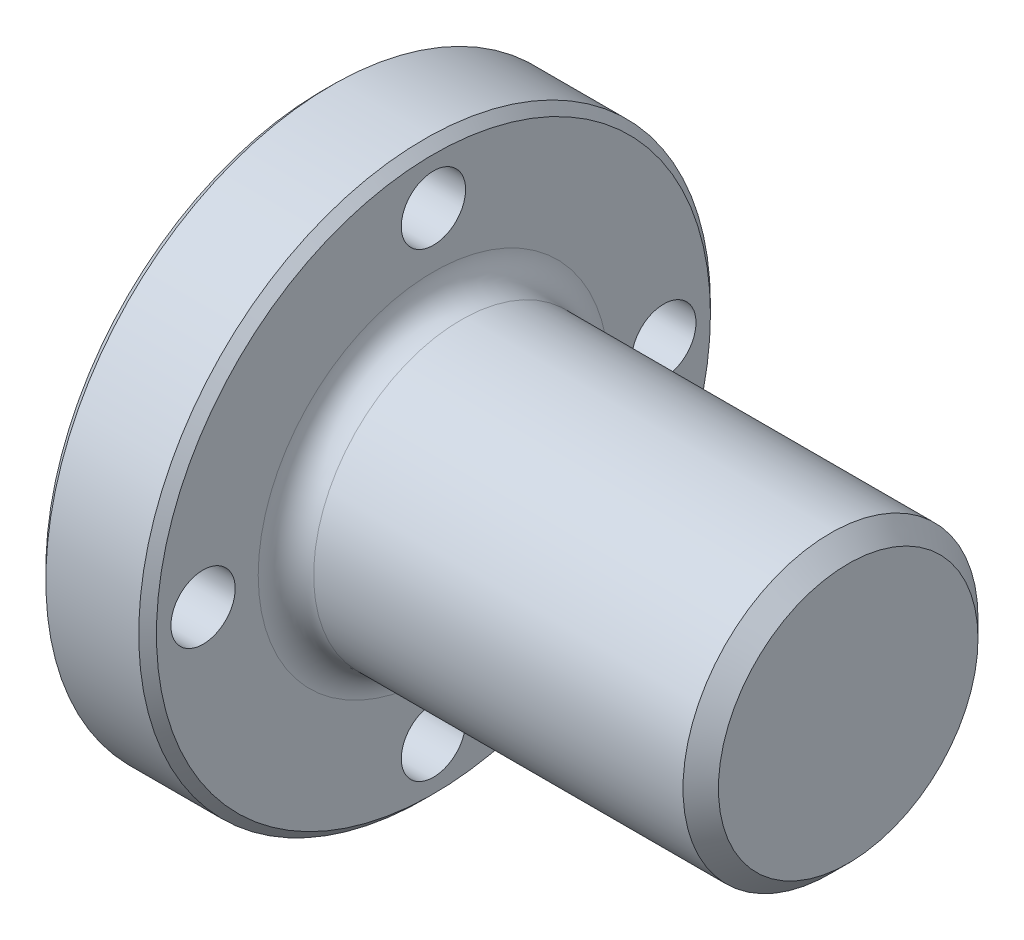
ISO-10303-21;
HEADER;
FILE_DESCRIPTION(('STEP AP214'),'2;1');
FILE_NAME('part.step','',(''),(''),'','','');
FILE_SCHEMA(('AUTOMOTIVE_DESIGN { 1 0 10303 214 1 1 1 1 }'));
ENDSEC;
DATA;
#1=APPLICATION_CONTEXT('core data for automotive mechanical design processes');
#2=APPLICATION_PROTOCOL_DEFINITION('international standard','automotive_design',2000,#1);
#3=PRODUCT_CONTEXT('',#1,'mechanical');
#4=PRODUCT('Part','Part','',(#3));
#5=PRODUCT_RELATED_PRODUCT_CATEGORY('part','',(#4));
#6=PRODUCT_DEFINITION_FORMATION('','',#4);
#7=PRODUCT_DEFINITION_CONTEXT('part definition',#1,'design');
#8=PRODUCT_DEFINITION('design','',#6,#7);
#9=PRODUCT_DEFINITION_SHAPE('','',#8);
#10=(LENGTH_UNIT() NAMED_UNIT(*) SI_UNIT(.MILLI.,.METRE.));
#11=(NAMED_UNIT(*) PLANE_ANGLE_UNIT() SI_UNIT($,.RADIAN.));
#12=(NAMED_UNIT(*) SI_UNIT($,.STERADIAN.) SOLID_ANGLE_UNIT());
#13=UNCERTAINTY_MEASURE_WITH_UNIT(LENGTH_MEASURE(1.E-05),#10,'distance_accuracy_value','');
#14=(GEOMETRIC_REPRESENTATION_CONTEXT(3) GLOBAL_UNCERTAINTY_ASSIGNED_CONTEXT((#13)) GLOBAL_UNIT_ASSIGNED_CONTEXT((#10,
#11,#12)) REPRESENTATION_CONTEXT('',''));
#15=CARTESIAN_POINT('',(0.,0.,0.));
#16=DIRECTION('',(0.,0.,1.));
#17=DIRECTION('',(1.,0.,0.));
#18=AXIS2_PLACEMENT_3D('',#15,#16,#17);
#19=CARTESIAN_POINT('',(9.525,0.,0.));
#20=DIRECTION('',(-1.,0.,0.));
#21=DIRECTION('',(0.,0.,1.));
#22=AXIS2_PLACEMENT_3D('',#19,#20,#21);
#23=CYLINDRICAL_SURFACE('',#22,24.6126);
#24=CARTESIAN_POINT('',(8.763,0.,0.));
#25=DIRECTION('',(1.,0.,0.));
#26=DIRECTION('',(0.,0.,-1.));
#27=AXIS2_PLACEMENT_3D('',#24,#25,#26);
#28=CIRCLE('',#27,24.6126);
#29=CARTESIAN_POINT('',(8.763,0.,-24.6126));
#30=VERTEX_POINT('',#29);
#31=EDGE_CURVE('E55',#30,#30,#28,.F.);
#32=ORIENTED_EDGE('',*,*,#31,.T.);
#33=EDGE_LOOP('',(#32));
#34=FACE_BOUND('',#33,.T.);
#35=CARTESIAN_POINT('',(0.761999999999999,0.,0.));
#36=DIRECTION('',(1.,0.,0.));
#37=DIRECTION('',(0.,0.,-1.));
#38=AXIS2_PLACEMENT_3D('',#35,#36,#37);
#39=CIRCLE('',#38,24.6126);
#40=CARTESIAN_POINT('',(0.761999999999999,0.,-24.6126));
#41=VERTEX_POINT('',#40);
#42=EDGE_CURVE('E60',#41,#41,#39,.T.);
#43=ORIENTED_EDGE('',*,*,#42,.T.);
#44=EDGE_LOOP('',(#43));
#45=FACE_BOUND('',#44,.T.);
#46=ADVANCED_FACE('F39',(#34,#45),#23,.T.);
#47=CARTESIAN_POINT('',(9.525,0.,0.));
#48=DIRECTION('',(1.,0.,0.));
#49=DIRECTION('',(0.,0.,-1.));
#50=AXIS2_PLACEMENT_3D('',#47,#48,#49);
#51=PLANE('',#50);
#52=CARTESIAN_POINT('',(9.525,0.,0.));
#53=DIRECTION('',(1.,0.,0.));
#54=DIRECTION('',(0.,0.,-1.));
#55=AXIS2_PLACEMENT_3D('',#52,#53,#54);
#56=CIRCLE('',#55,23.8506);
#57=CARTESIAN_POINT('',(9.525,0.,-23.8506));
#58=VERTEX_POINT('',#57);
#59=EDGE_CURVE('E63',#58,#58,#56,.T.);
#60=ORIENTED_EDGE('',*,*,#59,.T.);
#61=EDGE_LOOP('',(#60));
#62=FACE_BOUND('',#61,.T.);
#63=CARTESIAN_POINT('',(9.525,0.,0.));
#64=DIRECTION('',(1.,0.,0.));
#65=DIRECTION('',(0.,0.,-1.));
#66=AXIS2_PLACEMENT_3D('',#63,#64,#65);
#67=CIRCLE('',#66,15.0876);
#68=CARTESIAN_POINT('',(9.525,0.,-15.0876));
#69=VERTEX_POINT('',#68);
#70=EDGE_CURVE('E66',#69,#69,#67,.F.);
#71=ORIENTED_EDGE('',*,*,#70,.T.);
#72=EDGE_LOOP('',(#71));
#73=FACE_BOUND('',#72,.T.);
#74=CARTESIAN_POINT('',(9.525,0.,19.8374));
#75=DIRECTION('',(1.,0.,0.));
#76=DIRECTION('',(0.,0.,-1.));
#77=AXIS2_PLACEMENT_3D('',#74,#75,#76);
#78=CIRCLE('',#77,2.7686);
#79=CARTESIAN_POINT('',(9.525,0.,17.0688));
#80=VERTEX_POINT('',#79);
#81=EDGE_CURVE('E81',#80,#80,#78,.F.);
#82=ORIENTED_EDGE('',*,*,#81,.T.);
#83=EDGE_LOOP('',(#82));
#84=FACE_BOUND('',#83,.T.);
#85=CARTESIAN_POINT('',(9.525,19.8374,0.));
#86=DIRECTION('',(1.,0.,0.));
#87=DIRECTION('',(0.,0.,-1.));
#88=AXIS2_PLACEMENT_3D('',#85,#86,#87);
#89=CIRCLE('',#88,2.7686);
#90=CARTESIAN_POINT('',(9.525,19.8374,-2.7686));
#91=VERTEX_POINT('',#90);
#92=EDGE_CURVE('E84',#91,#91,#89,.F.);
#93=ORIENTED_EDGE('',*,*,#92,.T.);
#94=EDGE_LOOP('',(#93));
#95=FACE_BOUND('',#94,.T.);
#96=CARTESIAN_POINT('',(9.525,0.,-19.8374));
#97=DIRECTION('',(1.,0.,0.));
#98=DIRECTION('',(0.,0.,-1.));
#99=AXIS2_PLACEMENT_3D('',#96,#97,#98);
#100=CIRCLE('',#99,2.7686);
#101=CARTESIAN_POINT('',(9.525,0.,-22.606));
#102=VERTEX_POINT('',#101);
#103=EDGE_CURVE('E87',#102,#102,#100,.F.);
#104=ORIENTED_EDGE('',*,*,#103,.T.);
#105=EDGE_LOOP('',(#104));
#106=FACE_BOUND('',#105,.T.);
#107=CARTESIAN_POINT('',(9.525,-19.8374,0.));
#108=DIRECTION('',(1.,0.,0.));
#109=DIRECTION('',(0.,0.,-1.));
#110=AXIS2_PLACEMENT_3D('',#107,#108,#109);
#111=CIRCLE('',#110,2.7686);
#112=CARTESIAN_POINT('',(9.525,-19.8374,-2.7686));
#113=VERTEX_POINT('',#112);
#114=EDGE_CURVE('E90',#113,#113,#111,.F.);
#115=ORIENTED_EDGE('',*,*,#114,.T.);
#116=EDGE_LOOP('',(#115));
#117=FACE_BOUND('',#116,.T.);
#118=ADVANCED_FACE('F128',(#62,#73,#84,#95,#106,#117),#51,.T.);
#119=CARTESIAN_POINT('',(0.,0.,0.));
#120=DIRECTION('',(1.,0.,0.));
#121=DIRECTION('',(0.,0.,-1.));
#122=AXIS2_PLACEMENT_3D('',#119,#120,#121);
#123=PLANE('',#122);
#124=CARTESIAN_POINT('',(0.,0.,0.));
#125=DIRECTION('',(1.,0.,0.));
#126=DIRECTION('',(0.,0.,-1.));
#127=AXIS2_PLACEMENT_3D('',#124,#125,#126);
#128=CIRCLE('',#127,23.8506);
#129=CARTESIAN_POINT('',(0.,0.,-23.8506));
#130=VERTEX_POINT('',#129);
#131=EDGE_CURVE('E51',#130,#130,#128,.F.);
#132=ORIENTED_EDGE('',*,*,#131,.T.);
#133=EDGE_LOOP('',(#132));
#134=FACE_BOUND('',#133,.T.);
#135=CARTESIAN_POINT('',(0.,0.,0.));
#136=DIRECTION('',(1.,0.,0.));
#137=DIRECTION('',(0.,0.,-1.));
#138=AXIS2_PLACEMENT_3D('',#135,#136,#137);
#139=CIRCLE('',#138,9.0932);
#140=CARTESIAN_POINT('',(0.,0.,-9.0932));
#141=VERTEX_POINT('',#140);
#142=EDGE_CURVE('E75',#141,#141,#139,.T.);
#143=ORIENTED_EDGE('',*,*,#142,.T.);
#144=EDGE_LOOP('',(#143));
#145=FACE_BOUND('',#144,.T.);
#146=CARTESIAN_POINT('',(0.,0.,19.8374));
#147=DIRECTION('',(1.,0.,0.));
#148=DIRECTION('',(0.,0.,-1.));
#149=AXIS2_PLACEMENT_3D('',#146,#147,#148);
#150=CIRCLE('',#149,2.7686);
#151=CARTESIAN_POINT('',(0.,0.,17.0688));
#152=VERTEX_POINT('',#151);
#153=EDGE_CURVE('E93',#152,#152,#150,.T.);
#154=ORIENTED_EDGE('',*,*,#153,.T.);
#155=EDGE_LOOP('',(#154));
#156=FACE_BOUND('',#155,.T.);
#157=CARTESIAN_POINT('',(0.,19.8374,0.));
#158=DIRECTION('',(1.,0.,0.));
#159=DIRECTION('',(0.,0.,-1.));
#160=AXIS2_PLACEMENT_3D('',#157,#158,#159);
#161=CIRCLE('',#160,2.7686);
#162=CARTESIAN_POINT('',(0.,19.8374,-2.7686));
#163=VERTEX_POINT('',#162);
#164=EDGE_CURVE('E100',#163,#163,#161,.T.);
#165=ORIENTED_EDGE('',*,*,#164,.T.);
#166=EDGE_LOOP('',(#165));
#167=FACE_BOUND('',#166,.T.);
#168=CARTESIAN_POINT('',(0.,0.,-19.8374));
#169=DIRECTION('',(1.,0.,0.));
#170=DIRECTION('',(0.,0.,-1.));
#171=AXIS2_PLACEMENT_3D('',#168,#169,#170);
#172=CIRCLE('',#171,2.7686);
#173=CARTESIAN_POINT('',(0.,0.,-22.606));
#174=VERTEX_POINT('',#173);
#175=EDGE_CURVE('E97',#174,#174,#172,.T.);
#176=ORIENTED_EDGE('',*,*,#175,.T.);
#177=EDGE_LOOP('',(#176));
#178=FACE_BOUND('',#177,.T.);
#179=CARTESIAN_POINT('',(0.,-19.8374,0.));
#180=DIRECTION('',(1.,0.,0.));
#181=DIRECTION('',(0.,0.,-1.));
#182=AXIS2_PLACEMENT_3D('',#179,#180,#181);
#183=CIRCLE('',#182,2.7686);
#184=CARTESIAN_POINT('',(0.,-19.8374,-2.7686));
#185=VERTEX_POINT('',#184);
#186=EDGE_CURVE('E94',#185,#185,#183,.T.);
#187=ORIENTED_EDGE('',*,*,#186,.T.);
#188=EDGE_LOOP('',(#187));
#189=FACE_BOUND('',#188,.T.);
#190=ADVANCED_FACE('F106',(#134,#145,#156,#167,#178,#189),#123,.F.);
#191=CARTESIAN_POINT('',(45.2374,0.,0.));
#192=DIRECTION('',(-1.,0.,0.));
#193=DIRECTION('',(0.,0.,1.));
#194=AXIS2_PLACEMENT_3D('',#191,#192,#193);
#195=CYLINDRICAL_SURFACE('',#194,12.7);
#196=CARTESIAN_POINT('',(43.7134,0.,0.));
#197=DIRECTION('',(1.,0.,0.));
#198=DIRECTION('',(0.,0.,-1.));
#199=AXIS2_PLACEMENT_3D('',#196,#197,#198);
#200=CIRCLE('',#199,12.7);
#201=CARTESIAN_POINT('',(43.7134,0.,-12.7));
#202=VERTEX_POINT('',#201);
#203=EDGE_CURVE('E10',#202,#202,#200,.F.);
#204=ORIENTED_EDGE('',*,*,#203,.T.);
#205=EDGE_LOOP('',(#204));
#206=FACE_BOUND('',#205,.T.);
#207=CARTESIAN_POINT('',(11.9126,0.,0.));
#208=DIRECTION('',(1.,0.,0.));
#209=DIRECTION('',(0.,0.,-1.));
#210=AXIS2_PLACEMENT_3D('',#207,#208,#209);
#211=CIRCLE('',#210,12.7);
#212=CARTESIAN_POINT('',(11.9126,0.,-12.7));
#213=VERTEX_POINT('',#212);
#214=EDGE_CURVE('E69',#213,#213,#211,.T.);
#215=ORIENTED_EDGE('',*,*,#214,.T.);
#216=EDGE_LOOP('',(#215));
#217=FACE_BOUND('',#216,.T.);
#218=ADVANCED_FACE('F165',(#206,#217),#195,.T.);
#219=CARTESIAN_POINT('',(45.2374,0.,0.));
#220=DIRECTION('',(1.,0.,0.));
#221=DIRECTION('',(0.,0.,-1.));
#222=AXIS2_PLACEMENT_3D('',#219,#220,#221);
#223=PLANE('',#222);
#224=CARTESIAN_POINT('',(45.2374,0.,0.));
#225=DIRECTION('',(1.,0.,0.));
#226=DIRECTION('',(0.,0.,-1.));
#227=AXIS2_PLACEMENT_3D('',#224,#225,#226);
#228=CIRCLE('',#227,11.176);
#229=CARTESIAN_POINT('',(45.2374,0.,-11.176));
#230=VERTEX_POINT('',#229);
#231=EDGE_CURVE('E47',#230,#230,#228,.T.);
#232=ORIENTED_EDGE('',*,*,#231,.T.);
#233=EDGE_LOOP('',(#232));
#234=FACE_BOUND('',#233,.T.);
#235=ADVANCED_FACE('F170',(#234),#223,.T.);
#236=CARTESIAN_POINT('',(-4.826,0.,0.));
#237=DIRECTION('',(1.,0.,0.));
#238=DIRECTION('',(0.,0.,-1.));
#239=AXIS2_PLACEMENT_3D('',#236,#237,#238);
#240=CYLINDRICAL_SURFACE('',#239,8.7122);
#241=CARTESIAN_POINT('',(-0.381,0.,0.));
#242=DIRECTION('',(1.,0.,0.));
#243=DIRECTION('',(0.,0.,-1.));
#244=AXIS2_PLACEMENT_3D('',#241,#242,#243);
#245=CIRCLE('',#244,8.7122);
#246=CARTESIAN_POINT('',(-0.381,0.,-8.7122));
#247=VERTEX_POINT('',#246);
#248=EDGE_CURVE('E72',#247,#247,#245,.F.);
#249=ORIENTED_EDGE('',*,*,#248,.T.);
#250=EDGE_LOOP('',(#249));
#251=FACE_BOUND('',#250,.T.);
#252=CARTESIAN_POINT('',(-4.826,0.,0.));
#253=DIRECTION('',(1.,0.,0.));
#254=DIRECTION('',(0.,0.,-1.));
#255=AXIS2_PLACEMENT_3D('',#252,#253,#254);
#256=CIRCLE('',#255,8.7122);
#257=CARTESIAN_POINT('',(-4.826,0.,-8.7122));
#258=VERTEX_POINT('',#257);
#259=EDGE_CURVE('E78',#258,#258,#256,.T.);
#260=ORIENTED_EDGE('',*,*,#259,.T.);
#261=EDGE_LOOP('',(#260));
#262=FACE_BOUND('',#261,.T.);
#263=ADVANCED_FACE('F175',(#251,#262),#240,.T.);
#264=CARTESIAN_POINT('',(-4.826,0.,0.));
#265=DIRECTION('',(1.,0.,0.));
#266=DIRECTION('',(0.,0.,-1.));
#267=AXIS2_PLACEMENT_3D('',#264,#265,#266);
#268=PLANE('',#267);
#269=ORIENTED_EDGE('',*,*,#259,.F.);
#270=EDGE_LOOP('',(#269));
#271=FACE_BOUND('',#270,.T.);
#272=ADVANCED_FACE('F180',(#271),#268,.F.);
#273=CARTESIAN_POINT('',(45.2374,-19.8374,0.));
#274=DIRECTION('',(-1.,0.,0.));
#275=DIRECTION('',(0.,0.,1.));
#276=AXIS2_PLACEMENT_3D('',#273,#274,#275);
#277=CYLINDRICAL_SURFACE('',#276,2.7686);
#278=ORIENTED_EDGE('',*,*,#114,.F.);
#279=EDGE_LOOP('',(#278));
#280=FACE_BOUND('',#279,.T.);
#281=ORIENTED_EDGE('',*,*,#186,.F.);
#282=EDGE_LOOP('',(#281));
#283=FACE_BOUND('',#282,.T.);
#284=ADVANCED_FACE('F184',(#280,#283),#277,.F.);
#285=CARTESIAN_POINT('',(45.2374,0.,-19.8374));
#286=DIRECTION('',(-1.,0.,0.));
#287=DIRECTION('',(0.,0.,1.));
#288=AXIS2_PLACEMENT_3D('',#285,#286,#287);
#289=CYLINDRICAL_SURFACE('',#288,2.7686);
#290=ORIENTED_EDGE('',*,*,#103,.F.);
#291=EDGE_LOOP('',(#290));
#292=FACE_BOUND('',#291,.T.);
#293=ORIENTED_EDGE('',*,*,#175,.F.);
#294=EDGE_LOOP('',(#293));
#295=FACE_BOUND('',#294,.T.);
#296=ADVANCED_FACE('F123',(#292,#295),#289,.F.);
#297=CARTESIAN_POINT('',(45.2374,19.8374,0.));
#298=DIRECTION('',(-1.,0.,0.));
#299=DIRECTION('',(0.,0.,1.));
#300=AXIS2_PLACEMENT_3D('',#297,#298,#299);
#301=CYLINDRICAL_SURFACE('',#300,2.7686);
#302=ORIENTED_EDGE('',*,*,#92,.F.);
#303=EDGE_LOOP('',(#302));
#304=FACE_BOUND('',#303,.T.);
#305=ORIENTED_EDGE('',*,*,#164,.F.);
#306=EDGE_LOOP('',(#305));
#307=FACE_BOUND('',#306,.T.);
#308=ADVANCED_FACE('F112',(#304,#307),#301,.F.);
#309=CARTESIAN_POINT('',(45.2374,0.,19.8374));
#310=DIRECTION('',(-1.,0.,0.));
#311=DIRECTION('',(0.,0.,1.));
#312=AXIS2_PLACEMENT_3D('',#309,#310,#311);
#313=CYLINDRICAL_SURFACE('',#312,2.7686);
#314=ORIENTED_EDGE('',*,*,#81,.F.);
#315=EDGE_LOOP('',(#314));
#316=FACE_BOUND('',#315,.T.);
#317=ORIENTED_EDGE('',*,*,#153,.F.);
#318=EDGE_LOOP('',(#317));
#319=FACE_BOUND('',#318,.T.);
#320=ADVANCED_FACE('F109',(#316,#319),#313,.F.);
#321=CARTESIAN_POINT('',(-0.381,0.,0.));
#322=DIRECTION('',(1.,0.,0.));
#323=DIRECTION('',(0.,0.,-1.));
#324=AXIS2_PLACEMENT_3D('',#321,#322,#323);
#325=TOROIDAL_SURFACE('',#324,9.0932,0.381);
#326=ORIENTED_EDGE('',*,*,#248,.F.);
#327=EDGE_LOOP('',(#326));
#328=FACE_BOUND('',#327,.T.);
#329=ORIENTED_EDGE('',*,*,#142,.F.);
#330=EDGE_LOOP('',(#329));
#331=FACE_BOUND('',#330,.T.);
#332=ADVANCED_FACE('F111',(#328,#331),#325,.F.);
#333=CARTESIAN_POINT('',(11.9126,0.,0.));
#334=DIRECTION('',(1.,0.,0.));
#335=DIRECTION('',(0.,0.,-1.));
#336=AXIS2_PLACEMENT_3D('',#333,#334,#335);
#337=TOROIDAL_SURFACE('',#336,15.0876,2.3876);
#338=ORIENTED_EDGE('',*,*,#70,.F.);
#339=EDGE_LOOP('',(#338));
#340=FACE_BOUND('',#339,.T.);
#341=ORIENTED_EDGE('',*,*,#214,.F.);
#342=EDGE_LOOP('',(#341));
#343=FACE_BOUND('',#342,.T.);
#344=ADVANCED_FACE('F120',(#340,#343),#337,.F.);
#345=CARTESIAN_POINT('',(9.525,0.,0.));
#346=DIRECTION('',(-1.,0.,0.));
#347=DIRECTION('',(0.,0.,1.));
#348=AXIS2_PLACEMENT_3D('',#345,#346,#347);
#349=CONICAL_SURFACE('',#348,23.8506,0.785398163397442);
#350=ORIENTED_EDGE('',*,*,#31,.F.);
#351=EDGE_LOOP('',(#350));
#352=FACE_BOUND('',#351,.T.);
#353=ORIENTED_EDGE('',*,*,#59,.F.);
#354=EDGE_LOOP('',(#353));
#355=FACE_BOUND('',#354,.T.);
#356=ADVANCED_FACE('F141',(#352,#355),#349,.T.);
#357=CARTESIAN_POINT('',(0.761999999999999,0.,0.));
#358=DIRECTION('',(1.,0.,0.));
#359=DIRECTION('',(0.,0.,-1.));
#360=AXIS2_PLACEMENT_3D('',#357,#358,#359);
#361=CONICAL_SURFACE('',#360,24.6126,0.785398163397451);
#362=ORIENTED_EDGE('',*,*,#131,.F.);
#363=EDGE_LOOP('',(#362));
#364=FACE_BOUND('',#363,.T.);
#365=ORIENTED_EDGE('',*,*,#42,.F.);
#366=EDGE_LOOP('',(#365));
#367=FACE_BOUND('',#366,.T.);
#368=ADVANCED_FACE('F148',(#364,#367),#361,.T.);
#369=CARTESIAN_POINT('',(45.2374,0.,0.));
#370=DIRECTION('',(-1.,0.,0.));
#371=DIRECTION('',(0.,0.,1.));
#372=AXIS2_PLACEMENT_3D('',#369,#370,#371);
#373=CONICAL_SURFACE('',#372,11.176,0.785398163397443);
#374=ORIENTED_EDGE('',*,*,#203,.F.);
#375=EDGE_LOOP('',(#374));
#376=FACE_BOUND('',#375,.T.);
#377=ORIENTED_EDGE('',*,*,#231,.F.);
#378=EDGE_LOOP('',(#377));
#379=FACE_BOUND('',#378,.T.);
#380=ADVANCED_FACE('F42',(#376,#379),#373,.T.);
#381=CLOSED_SHELL('',(#46,#118,#190,#218,#235,#263,#272,#284,#296,#308,#320,#332,#344,#356,#368,#380));
#382=MANIFOLD_SOLID_BREP('B2',#381);
#383=ADVANCED_BREP_SHAPE_REPRESENTATION('',(#18,#382),#14);
#384=SHAPE_DEFINITION_REPRESENTATION(#9,#383);
ENDSEC;
END-ISO-10303-21;
